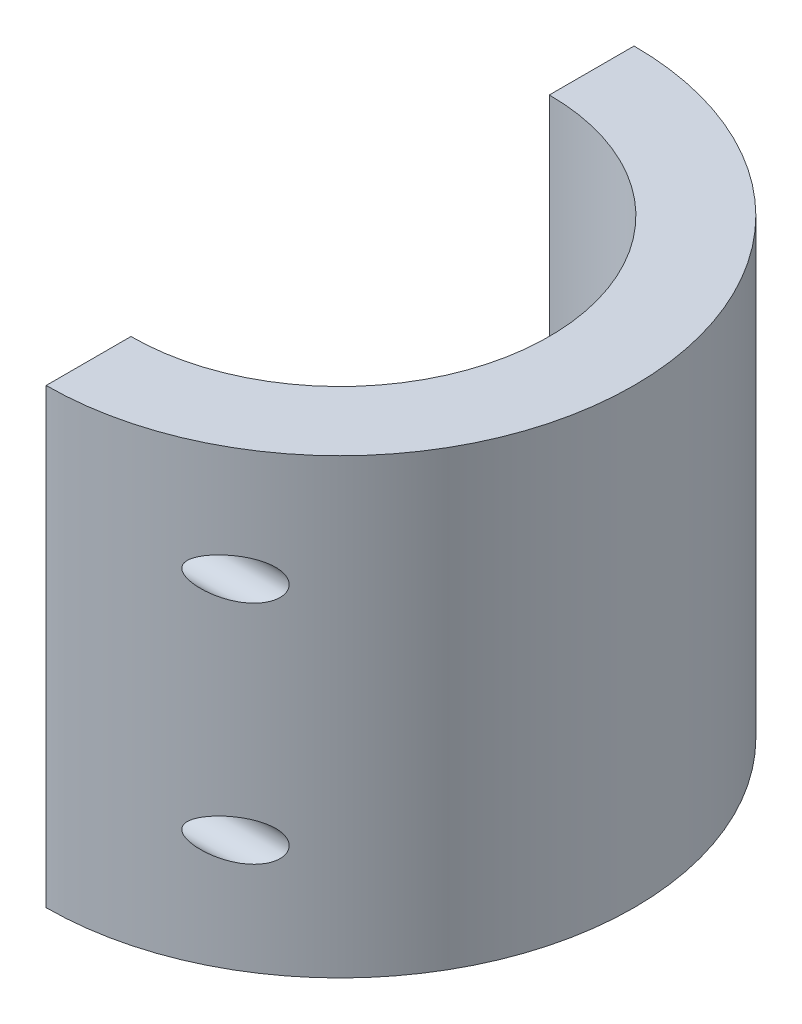
ISO-10303-21;
HEADER;
FILE_DESCRIPTION(('STEP AP214'),'2;1');
FILE_NAME('part.step','',(''),(''),'','','');
FILE_SCHEMA(('AUTOMOTIVE_DESIGN { 1 0 10303 214 1 1 1 1 }'));
ENDSEC;
DATA;
#1=APPLICATION_CONTEXT('core data for automotive mechanical design processes');
#2=APPLICATION_PROTOCOL_DEFINITION('international standard','automotive_design',2000,#1);
#3=PRODUCT_CONTEXT('',#1,'mechanical');
#4=PRODUCT('Part','Part','',(#3));
#5=PRODUCT_RELATED_PRODUCT_CATEGORY('part','',(#4));
#6=PRODUCT_DEFINITION_FORMATION('','',#4);
#7=PRODUCT_DEFINITION_CONTEXT('part definition',#1,'design');
#8=PRODUCT_DEFINITION('design','',#6,#7);
#9=PRODUCT_DEFINITION_SHAPE('','',#8);
#10=(LENGTH_UNIT() NAMED_UNIT(*) SI_UNIT(.MILLI.,.METRE.));
#11=(NAMED_UNIT(*) PLANE_ANGLE_UNIT() SI_UNIT($,.RADIAN.));
#12=(NAMED_UNIT(*) SI_UNIT($,.STERADIAN.) SOLID_ANGLE_UNIT());
#13=UNCERTAINTY_MEASURE_WITH_UNIT(LENGTH_MEASURE(1.E-05),#10,'distance_accuracy_value','');
#14=(GEOMETRIC_REPRESENTATION_CONTEXT(3) GLOBAL_UNCERTAINTY_ASSIGNED_CONTEXT((#13)) GLOBAL_UNIT_ASSIGNED_CONTEXT((#10,
#11,#12)) REPRESENTATION_CONTEXT('',''));
#15=CARTESIAN_POINT('',(0.,0.,0.));
#16=DIRECTION('',(0.,0.,1.));
#17=DIRECTION('',(1.,0.,0.));
#18=AXIS2_PLACEMENT_3D('',#15,#16,#17);
#19=CARTESIAN_POINT('',(0.,20.32,0.));
#20=DIRECTION('',(0.,-1.,0.));
#21=DIRECTION('',(0.,0.,-1.));
#22=AXIS2_PLACEMENT_3D('',#19,#20,#21);
#23=CYLINDRICAL_SURFACE('',#22,13.208);
#24=CARTESIAN_POINT('',(8.12403028059349,15.24,-10.414));
#25=CARTESIAN_POINT('',(8.12402675839397,15.2763425855837,-10.4140029529824));
#26=CARTESIAN_POINT('',(8.12114471221945,15.3127085634343,-10.4162530184276));
#27=CARTESIAN_POINT('',(8.10989942678019,15.3840607142762,-10.4250104305107));
#28=CARTESIAN_POINT('',(8.10152879578814,15.4190449589643,-10.431523518334));
#29=CARTESIAN_POINT('',(8.08014387084861,15.4862733885964,-10.4480963483917));
#30=CARTESIAN_POINT('',(8.06717093354128,15.5185389077562,-10.4581244947683));
#31=CARTESIAN_POINT('',(8.03743681280789,15.580160225113,-10.4809935702237));
#32=CARTESIAN_POINT('',(8.02067400406546,15.6095147671213,-10.4938357060313));
#33=CARTESIAN_POINT('',(7.97511667896051,15.6789556067451,-10.5285299327843));
#34=CARTESIAN_POINT('',(7.9444726520898,15.7171660373587,-10.5516962182333));
#35=CARTESIAN_POINT('',(7.87856697558927,15.7871319441255,-10.6009980079177));
#36=CARTESIAN_POINT('',(7.84329382947684,15.8188708296954,-10.6271408824121));
#37=CARTESIAN_POINT('',(7.74755476468098,15.8937762719516,-10.6972865690547));
#38=CARTESIAN_POINT('',(7.68460751080956,15.93247333955,-10.7426444021067));
#39=CARTESIAN_POINT('',(7.55393517240757,15.9979170309071,-10.834933615685));
#40=CARTESIAN_POINT('',(7.48620057106773,16.0246390290152,-10.8818680273123));
#41=CARTESIAN_POINT('',(7.35868532034689,16.0647818227098,-10.9684086198165));
#42=CARTESIAN_POINT('',(7.29933394982558,16.0796353355708,-11.0080037356914));
#43=CARTESIAN_POINT('',(7.17912920646289,16.103284161471,-11.0867730370386));
#44=CARTESIAN_POINT('',(7.11827483410135,16.1120753241009,-11.1259469160968));
#45=CARTESIAN_POINT('',(6.99544156378007,16.1242988577958,-11.2035865646449));
#46=CARTESIAN_POINT('',(6.93346077114572,16.1277211494366,-11.2420508685844));
#47=CARTESIAN_POINT('',(6.80880870397798,16.1296845521613,-11.3179820585784));
#48=CARTESIAN_POINT('',(6.74613726640222,16.1282244849364,-11.3554487016579));
#49=CARTESIAN_POINT('',(6.60031165406951,16.1195865996291,-11.4409960971043));
#50=CARTESIAN_POINT('',(6.51700294863812,16.1107329174484,-11.4886487755221));
#51=CARTESIAN_POINT('',(6.35017570329106,16.0855621350588,-11.5816951652706));
#52=CARTESIAN_POINT('',(6.26665705123765,16.0692392970186,-11.6270871101177));
#53=CARTESIAN_POINT('',(6.0999893971425,16.0290590212001,-11.7153873010863));
#54=CARTESIAN_POINT('',(6.01684092696757,16.0051929894365,-11.7582926479117));
#55=CARTESIAN_POINT('',(5.85192194850897,15.9493219871575,-11.8412311585377));
#56=CARTESIAN_POINT('',(5.77014973516252,15.9173280217692,-11.8812681128752));
#57=CARTESIAN_POINT('',(5.65131368791182,15.8626929647352,-11.9379961197164));
#58=CARTESIAN_POINT('',(5.61312110632241,15.84384452982,-11.9559972376178));
#59=CARTESIAN_POINT('',(5.53773307468417,15.8035199837386,-11.9911008546527));
#60=CARTESIAN_POINT('',(5.50053711315328,15.7820452531895,-12.0082038192344));
#61=CARTESIAN_POINT('',(5.42781513446303,15.7360917494589,-12.0412488397324));
#62=CARTESIAN_POINT('',(5.39228112896853,15.711629965557,-12.0571967083979));
#63=CARTESIAN_POINT('',(5.32354185916334,15.6589153327588,-12.0877032442451));
#64=CARTESIAN_POINT('',(5.29033199752997,15.6306703097593,-12.102264675736));
#65=CARTESIAN_POINT('',(5.23527942201222,15.5767110700311,-12.1261613021378));
#66=CARTESIAN_POINT('',(5.21262394238774,15.552022293299,-12.1359111058156));
#67=CARTESIAN_POINT('',(5.17079373646744,15.4993153744729,-12.1537923368746));
#68=CARTESIAN_POINT('',(5.15160946761373,15.4713067213528,-12.1619282071798));
#69=CARTESIAN_POINT('',(5.12468359438533,15.4224677641265,-12.1732910305729));
#70=CARTESIAN_POINT('',(5.11531421171454,15.4027118462638,-12.1772286609773));
#71=CARTESIAN_POINT('',(5.0995171385575,15.3618475289058,-12.1838525236996));
#72=CARTESIAN_POINT('',(5.09308623655063,15.3407406348311,-12.1865401222585));
#73=CARTESIAN_POINT('',(5.08380220538361,15.2973664736221,-12.1904161617635));
#74=CARTESIAN_POINT('',(5.08098601406709,15.2750896109016,-12.1915891257497));
#75=CARTESIAN_POINT('',(5.07945156958719,15.2303727077212,-12.1922285452093));
#76=CARTESIAN_POINT('',(5.08073141585397,15.20793274776,-12.1916957921388));
#77=CARTESIAN_POINT('',(5.08678112610931,15.1665525388773,-12.1891726368652));
#78=CARTESIAN_POINT('',(5.09108861015596,15.1475289020143,-12.1873753246701));
#79=CARTESIAN_POINT('',(5.10226304469577,15.1103958393931,-12.1827013687));
#80=CARTESIAN_POINT('',(5.10913161261638,15.0922869995897,-12.1798240428453));
#81=CARTESIAN_POINT('',(5.12958518023046,15.0468507942085,-12.1712284482766));
#82=CARTESIAN_POINT('',(5.14474450319814,15.0203654879068,-12.1648345920944));
#83=CARTESIAN_POINT('',(5.17856469878685,14.9702059339822,-12.1504762870157));
#84=CARTESIAN_POINT('',(5.19723664443767,14.946540973359,-12.1425068672258));
#85=CARTESIAN_POINT('',(5.25404059548756,14.8822585898889,-12.1180823221139));
#86=CARTESIAN_POINT('',(5.29501829276508,14.8447146979247,-12.1002567688962));
#87=CARTESIAN_POINT('',(5.38093909694976,14.7759685617304,-12.0622966972846));
#88=CARTESIAN_POINT('',(5.4258930911849,14.7447845534712,-12.0421557911828));
#89=CARTESIAN_POINT('',(5.52304760291226,14.6841717305416,-11.9979312052203));
#90=CARTESIAN_POINT('',(5.57550541134205,14.6552996001608,-11.9736567951988));
#91=CARTESIAN_POINT('',(5.68203980516664,14.6022961266128,-11.9234713109871));
#92=CARTESIAN_POINT('',(5.7361181011353,14.5781700121371,-11.8975584727956));
#93=CARTESIAN_POINT('',(5.84536378540801,14.5339185173396,-11.8442681910116));
#94=CARTESIAN_POINT('',(5.90053359751777,14.5138034869707,-11.8168871840169));
#95=CARTESIAN_POINT('',(6.01144353139748,14.4772358022923,-11.7608535237564));
#96=CARTESIAN_POINT('',(6.0671837943324,14.4607840786142,-11.7322005495706));
#97=CARTESIAN_POINT('',(6.20670162745626,14.424006935579,-11.6592031402946));
#98=CARTESIAN_POINT('',(6.29066550232646,14.4058108389916,-11.6141281956257));
#99=CARTESIAN_POINT('',(6.45862483472474,14.37692634902,-11.5215726131762));
#100=CARTESIAN_POINT('',(6.54262027405969,14.3662431455044,-11.4740903366506));
#101=CARTESIAN_POINT('',(6.70975512883651,14.3527523906886,-11.3771591323494));
#102=CARTESIAN_POINT('',(6.7928964471224,14.3499191543355,-11.3277171566402));
#103=CARTESIAN_POINT('',(6.95790929967787,14.3528172959755,-11.2271137524416));
#104=CARTESIAN_POINT('',(7.03978200135329,14.3585402611971,-11.1759540612052));
#105=CARTESIAN_POINT('',(7.19667453799487,14.3791595605468,-11.0755266507942));
#106=CARTESIAN_POINT('',(7.27181141371172,14.3934869266661,-11.0263287129227));
#107=CARTESIAN_POINT('',(7.41930584125426,14.4323906437557,-10.9276260516637));
#108=CARTESIAN_POINT('',(7.49166360858563,14.4569661982719,-10.878121352411));
#109=CARTESIAN_POINT('',(7.61931599124117,14.5131092848789,-10.7889868170932));
#110=CARTESIAN_POINT('',(7.67535558463602,14.5426541733931,-10.7491674766562));
#111=CARTESIAN_POINT('',(7.78258904140313,14.6118514768532,-10.6717803118799));
#112=CARTESIAN_POINT('',(7.83379491127137,14.6514778933603,-10.6342069986842));
#113=CARTESIAN_POINT('',(7.90921944154319,14.7242002428284,-10.5781265872595));
#114=CARTESIAN_POINT('',(7.93597384376173,14.7534500650328,-10.5580567391003));
#115=CARTESIAN_POINT('',(7.98570484295272,14.8165083423367,-10.5204916885031));
#116=CARTESIAN_POINT('',(8.00868557344695,14.8503117347327,-10.5029936712248));
#117=CARTESIAN_POINT('',(8.04573252206672,14.9157333803322,-10.4746309960392));
#118=CARTESIAN_POINT('',(8.06066193312728,14.9465846738334,-10.4631378502726));
#119=CARTESIAN_POINT('',(8.0862765704699,15.0109609005529,-10.4433547530368));
#120=CARTESIAN_POINT('',(8.0969686857514,15.0444813867311,-10.4350596028655));
#121=CARTESIAN_POINT('',(8.11132349134013,15.1050389865113,-10.4239031445968));
#122=CARTESIAN_POINT('',(8.11606344107157,15.1316696992383,-10.4202108752562));
#123=CARTESIAN_POINT('',(8.12241817037074,15.1855292230289,-10.4152581848575));
#124=CARTESIAN_POINT('',(8.12403292079142,15.2127580396683,-10.4139977864803));
#125=CARTESIAN_POINT('',(8.12403028059349,15.24,-10.414));
#126=B_SPLINE_CURVE_WITH_KNOTS('',3,(#24,#25,#26,#27,#28,#29,#30,#31,#32,#33,#34,#35,#36,#37,
#38,#39,#40,#41,#42,#43,#44,#45,#46,#47,#48,#49,#50,#51,#52,#53,#54,#55,#56,#57,#58,#59,#60,#61,
#62,#63,#64,#65,#66,#67,#68,#69,#70,#71,#72,#73,#74,#75,#76,#77,#78,#79,#80,#81,#82,#83,#84,#85,
#86,#87,#88,#89,#90,#91,#92,#93,#94,#95,#96,#97,#98,#99,#100,#101,#102,#103,#104,#105,#106,#107,
#108,#109,#110,#111,#112,#113,#114,#115,#116,#117,#118,#119,#120,#121,#122,#123,#124,#125),
.UNSPECIFIED.,.T.,.F.,(4,2,2,2,2,2,2,2,2,2,2,2,2,2,2,2,2,2,2,2,2,2,2,2,2,2,2,2,2,2,2,2,2,2,2,2,
2,2,2,2,2,2,2,2,2,2,2,2,2,2,4),(0.,0.108895737153561,0.217938431210734,0.326025096118373,
0.434158203071781,0.59579057708297,0.757832244882077,1.01648891326617,1.27567507199651,
1.49400486595239,1.7124839849611,1.93137278407168,2.15031441362983,2.439120356858,
2.72814853523972,3.01750719861366,3.30647614264454,3.44512105882961,3.58369340157598,
3.72151140690776,3.85904860624725,3.96350313672445,4.06766600212435,4.13410138319973,
4.20046398110345,4.26749946003276,4.33450383887303,4.39302492076745,4.45158302384875,
4.5445807070555,4.63787661939231,4.81199272936052,4.98660128035837,5.18013722901771,
5.37388521681995,5.5681268485781,5.76241776959144,6.05312830478732,6.34403946461023,
6.63399763412182,6.92367089355621,7.19602360224634,7.46835514855901,7.69222171994366,
7.91551673038549,8.04845386564781,8.18124440155547,8.28928568659526,8.39715059023283,
8.47877674966292,8.56040367037267),.UNSPECIFIED.);
#127=CARTESIAN_POINT('',(8.12403028059349,15.24,-10.414));
#128=VERTEX_POINT('',#127);
#129=EDGE_CURVE('E43',#128,#128,#126,.T.);
#130=ORIENTED_EDGE('',*,*,#129,.T.);
#131=EDGE_LOOP('',(#130));
#132=FACE_BOUND('',#131,.T.);
#133=CARTESIAN_POINT('',(5.08,15.24,12.192));
#134=CARTESIAN_POINT('',(5.08000265332139,15.2615626758488,12.191998947532));
#135=CARTESIAN_POINT('',(5.08190721766739,15.283137429931,12.1912058541229));
#136=CARTESIAN_POINT('',(5.08927926000099,15.32556219886,12.188130102399));
#137=CARTESIAN_POINT('',(5.09475236539998,15.3464110141437,12.1858450913965));
#138=CARTESIAN_POINT('',(5.11048954060207,15.3922011635461,12.1792548843575));
#139=CARTESIAN_POINT('',(5.12163394786787,15.4167807400137,12.1745769095507));
#140=CARTESIAN_POINT('',(5.14733963061768,15.4637100956346,12.163731118152));
#141=CARTESIAN_POINT('',(5.16190864167248,15.4860546609575,12.1575599277107));
#142=CARTESIAN_POINT('',(5.20478672292413,15.5440202962613,12.1392881375161));
#143=CARTESIAN_POINT('',(5.23541555345702,15.5775636140621,12.1261258865621));
#144=CARTESIAN_POINT('',(5.30049656906654,15.639682111218,12.0978211873688));
#145=CARTESIAN_POINT('',(5.33495952298013,15.6682426876614,12.0826731392646));
#146=CARTESIAN_POINT('',(5.40906433375384,15.7236242933088,12.0496913807935));
#147=CARTESIAN_POINT('',(5.44889926386589,15.7501124681169,12.0317393602677));
#148=CARTESIAN_POINT('',(5.53022248038257,15.7994583134168,11.9945783296891));
#149=CARTESIAN_POINT('',(5.5717125282732,15.822311979516,11.9753679656722));
#150=CARTESIAN_POINT('',(5.65583778803919,15.8650177237459,11.9358672576688));
#151=CARTESIAN_POINT('',(5.69847538909956,15.8848628592879,11.9155745575298));
#152=CARTESIAN_POINT('',(5.78446119789411,15.9218879885231,11.8740707391578));
#153=CARTESIAN_POINT('',(5.82780963114013,15.9390671176028,11.8528593258174));
#154=CARTESIAN_POINT('',(5.9529204306029,15.9849423891685,11.7907705918396));
#155=CARTESIAN_POINT('',(6.03527279721911,16.0106456756279,11.7488480243608));
#156=CARTESIAN_POINT('',(6.20066441330851,16.0545505707737,11.6624077431794));
#157=CARTESIAN_POINT('',(6.28370419502289,16.0727456753567,11.6178878174067));
#158=CARTESIAN_POINT('',(6.44973591045947,16.1017687151268,11.5265404342398));
#159=CARTESIAN_POINT('',(6.53272783570768,16.1126019326016,11.4797146572636));
#160=CARTESIAN_POINT('',(6.69808827718878,16.1266179548147,11.3840243407924));
#161=CARTESIAN_POINT('',(6.78045719691597,16.1298062268493,11.3351612837206));
#162=CARTESIAN_POINT('',(6.96540211603526,16.1275903225821,11.2226977674856));
#163=CARTESIAN_POINT('',(7.06766433007552,16.1197368149188,11.1585684845188));
#164=CARTESIAN_POINT('',(7.21831196301267,16.0961391954973,11.0612307922892));
#165=CARTESIAN_POINT('',(7.26803964083004,16.0863137046584,11.0286152560307));
#166=CARTESIAN_POINT('',(7.36629942762439,16.062247252315,10.9632281418294));
#167=CARTESIAN_POINT('',(7.41483204926339,16.048008221076,10.9304566382564));
#168=CARTESIAN_POINT('',(7.52278599709102,16.0101545433959,10.8565314317144));
#169=CARTESIAN_POINT('',(7.58173668583191,15.9850619685852,10.8154263279579));
#170=CARTESIAN_POINT('',(7.69573850777801,15.9253967298764,10.7346040151968));
#171=CARTESIAN_POINT('',(7.75079442725941,15.890835965323,10.6948851342003));
#172=CARTESIAN_POINT('',(7.83814482120595,15.8231520458478,10.6309309699663));
#173=CARTESIAN_POINT('',(7.87211093270442,15.7930650234388,10.605787658919));
#174=CARTESIAN_POINT('',(7.93592005772034,15.7269681553587,10.5581253121081));
#175=CARTESIAN_POINT('',(7.96576945745568,15.6909676777033,10.5356022203139));
#176=CARTESIAN_POINT('',(8.01256551854628,15.6229213903848,10.50003279194));
#177=CARTESIAN_POINT('',(8.03084688459522,15.5922932438514,10.4860469253109));
#178=CARTESIAN_POINT('',(8.06325306743881,15.5277473126463,10.461148656329));
#179=CARTESIAN_POINT('',(8.07738340457891,15.4938339774563,10.4502321729199));
#180=CARTESIAN_POINT('',(8.09864316918808,15.4289010454086,10.433762295634));
#181=CARTESIAN_POINT('',(8.10652816964349,15.3982776305261,10.4276324086019));
#182=CARTESIAN_POINT('',(8.11811737388908,15.3357824905694,10.418612648876));
#183=CARTESIAN_POINT('',(8.12182411177939,15.3039115342751,10.4157208123241));
#184=CARTESIAN_POINT('',(8.1247745534717,15.2397578995004,10.4134195399056));
#185=CARTESIAN_POINT('',(8.12400765374055,15.2074744239449,10.4140183777244));
#186=CARTESIAN_POINT('',(8.11804884387974,15.1435730395876,10.4186640410192));
#187=CARTESIAN_POINT('',(8.11285567214777,15.1119553231775,10.4227118495411));
#188=CARTESIAN_POINT('',(8.09865015783683,15.0511657185877,10.4337532133669));
#189=CARTESIAN_POINT('',(8.08975521808575,15.0219491632248,10.4406561783126));
#190=CARTESIAN_POINT('',(8.06869656278258,14.9654682499407,10.4569391868367));
#191=CARTESIAN_POINT('',(8.0565315968777,14.9382046438251,10.4663201779088));
#192=CARTESIAN_POINT('',(8.02256891621744,14.8725149334906,10.4923928987179));
#193=CARTESIAN_POINT('',(7.99902499303164,14.8355014950094,10.5103711688927));
#194=CARTESIAN_POINT('',(7.94740837470955,14.7666411690873,10.5494559645128));
#195=CARTESIAN_POINT('',(7.91932415900529,14.734807849281,10.570570436402));
#196=CARTESIAN_POINT('',(7.84401311291277,14.6602745486255,10.6266611571314));
#197=CARTESIAN_POINT('',(7.79457831308135,14.6208615974631,10.6630140295938));
#198=CARTESIAN_POINT('',(7.69096705844371,14.5517490661186,10.7379892332738));
#199=CARTESIAN_POINT('',(7.63678204427822,14.5220674964739,10.7766156181936));
#200=CARTESIAN_POINT('',(7.53431464697586,14.4749998834221,10.8484392498244));
#201=CARTESIAN_POINT('',(7.48648540439754,14.4564038893431,10.8815100001044));
#202=CARTESIAN_POINT('',(7.38923280444604,14.4242176886859,10.947783707523));
#203=CARTESIAN_POINT('',(7.33980840456201,14.410630830934,10.9809867381606));
#204=CARTESIAN_POINT('',(7.23969437521593,14.3878603023203,11.0472486592328));
#205=CARTESIAN_POINT('',(7.18900189495267,14.3786877095453,11.0803069828242));
#206=CARTESIAN_POINT('',(7.08676172150619,14.3643325723175,11.1459754136832));
#207=CARTESIAN_POINT('',(7.03521376891457,14.3591512616061,11.1785853793025));
#208=CARTESIAN_POINT('',(6.90302649511457,14.3505703155892,11.2609251239189));
#209=CARTESIAN_POINT('',(6.82194985122154,14.349709721088,11.3102268829818));
#210=CARTESIAN_POINT('',(6.65893698210065,14.3557704387428,11.4069636608299));
#211=CARTESIAN_POINT('',(6.57700018436147,14.3626973086948,11.4543973213609));
#212=CARTESIAN_POINT('',(6.41305542142474,14.38382117655,11.5469833201934));
#213=CARTESIAN_POINT('',(6.33104815031715,14.3979998941558,11.5921410825984));
#214=CARTESIAN_POINT('',(6.16736357049874,14.4335229903109,11.6800474795201));
#215=CARTESIAN_POINT('',(6.08568605689757,14.4548618625858,11.7227979358814));
#216=CARTESIAN_POINT('',(5.94625533404625,14.4980543764139,11.7939642215788));
#217=CARTESIAN_POINT('',(5.88825649286033,14.5180626718615,11.8230202114988));
#218=CARTESIAN_POINT('',(5.77310479118703,14.5624567148627,11.8796739185689));
#219=CARTESIAN_POINT('',(5.71595333750525,14.5868490146193,11.9072693718197));
#220=CARTESIAN_POINT('',(5.59404292788824,14.6450797291898,11.9650814483429));
#221=CARTESIAN_POINT('',(5.52954905284444,14.6798079240336,11.9949998688095));
#222=CARTESIAN_POINT('',(5.43608737723812,14.7385955219775,12.0374995941369));
#223=CARTESIAN_POINT('',(5.4055232256502,14.7592714193416,12.0512510772472));
#224=CARTESIAN_POINT('',(5.34597278988651,14.803316656598,12.0777851539895));
#225=CARTESIAN_POINT('',(5.31698474055448,14.8266828879939,12.0905688380815));
#226=CARTESIAN_POINT('',(5.26770377633095,14.8710423979019,12.1121060398418));
#227=CARTESIAN_POINT('',(5.24693019643293,14.8913713954494,12.1211159110098));
#228=CARTESIAN_POINT('',(5.20741154040699,14.9344049250286,12.1381461315777));
#229=CARTESIAN_POINT('',(5.18867002328848,14.9571134921988,12.1461647482018));
#230=CARTESIAN_POINT('',(5.15399121537088,15.0055938530021,12.1609209379426));
#231=CARTESIAN_POINT('',(5.13810222233393,15.0314079002852,12.1676365794836));
#232=CARTESIAN_POINT('',(5.11118438166107,15.0858552956002,12.1789685244103));
#233=CARTESIAN_POINT('',(5.10013021617098,15.1144729726581,12.1835957679827));
#234=CARTESIAN_POINT('',(5.08838203103187,15.1596901004209,12.188504885183));
#235=CARTESIAN_POINT('',(5.08526089117568,15.1755586382744,12.1898068393737));
#236=CARTESIAN_POINT('',(5.08106894664394,15.207615860256,12.1915547638821));
#237=CARTESIAN_POINT('',(5.07999800712096,15.2238045232578,12.1920007904965));
#238=CARTESIAN_POINT('',(5.08,15.24,12.192));
#239=B_SPLINE_CURVE_WITH_KNOTS('',3,(#133,#134,#135,#136,#137,#138,#139,#140,#141,#142,#143,
#144,#145,#146,#147,#148,#149,#150,#151,#152,#153,#154,#155,#156,#157,#158,#159,#160,#161,#162,
#163,#164,#165,#166,#167,#168,#169,#170,#171,#172,#173,#174,#175,#176,#177,#178,#179,#180,#181,
#182,#183,#184,#185,#186,#187,#188,#189,#190,#191,#192,#193,#194,#195,#196,#197,#198,#199,#200,
#201,#202,#203,#204,#205,#206,#207,#208,#209,#210,#211,#212,#213,#214,#215,#216,#217,#218,#219,
#220,#221,#222,#223,#224,#225,#226,#227,#228,#229,#230,#231,#232,#233,#234,#235,#236,#237,#238),
.UNSPECIFIED.,.T.,.F.,(4,2,2,2,2,2,2,2,2,2,2,2,2,2,2,2,2,2,2,2,2,2,2,2,2,2,2,2,2,2,2,2,2,2,2,2,
2,2,2,2,2,2,2,2,2,2,2,2,2,2,2,2,4),(0.,0.0646175459399832,0.129337237786517,0.211040465967415,
0.292930051403707,0.434010800599707,0.575498312023582,0.728547444055283,0.881764049958487,
1.03532901120205,1.18894367155296,1.47628476516741,1.76387425347483,2.05125717260455,
2.3384345079483,2.70027143956326,2.88096148763058,3.06157262199752,3.28940439275697,
3.51695113442761,3.67215607369366,3.82711746960812,3.94166065793117,4.05605082140716,
4.15226856616405,4.24842792377906,4.34481529328807,4.44123014488804,4.53479566565843,
4.62839701388988,4.7698152091509,4.91159804048266,5.12916863619988,5.34713966108976,
5.53003747841592,5.71305735013549,5.89653416578173,6.08006767304192,6.36434261924857,
6.64882057706139,6.93258493774245,7.21613157727491,7.41964514876276,7.62346545397278,
7.86026001124177,7.97830517857842,8.09621529626722,8.18737553345578,8.27869293636963,
8.37143464545185,8.4636847166274,8.51222140143741,8.56075489374378),.UNSPECIFIED.);
#240=CARTESIAN_POINT('',(5.08,15.24,12.192));
#241=VERTEX_POINT('',#240);
#242=EDGE_CURVE('E193',#241,#241,#239,.T.);
#243=ORIENTED_EDGE('',*,*,#242,.T.);
#244=EDGE_LOOP('',(#243));
#245=FACE_BOUND('',#244,.T.);
#246=CARTESIAN_POINT('',(5.07999999999999,5.08,12.192));
#247=CARTESIAN_POINT('',(5.08000265332138,5.10156267584877,12.191998947532));
#248=CARTESIAN_POINT('',(5.08190721766738,5.12313742993104,12.1912058541229));
#249=CARTESIAN_POINT('',(5.08927926000098,5.16556219886003,12.188130102399));
#250=CARTESIAN_POINT('',(5.09475236539997,5.18641101414372,12.1858450913965));
#251=CARTESIAN_POINT('',(5.11048954060206,5.23220116354605,12.1792548843575));
#252=CARTESIAN_POINT('',(5.12163394786787,5.25678074001369,12.1745769095507));
#253=CARTESIAN_POINT('',(5.14733963061767,5.30371009563462,12.163731118152));
#254=CARTESIAN_POINT('',(5.16190864167248,5.32605466095749,12.1575599277107));
#255=CARTESIAN_POINT('',(5.20478672292413,5.38402029626132,12.1392881375161));
#256=CARTESIAN_POINT('',(5.23541555345701,5.41756361406212,12.1261258865621));
#257=CARTESIAN_POINT('',(5.30049656906654,5.47968211121798,12.0978211873688));
#258=CARTESIAN_POINT('',(5.33495952298013,5.50824268766139,12.0826731392646));
#259=CARTESIAN_POINT('',(5.40906433375384,5.56362429330875,12.0496913807936));
#260=CARTESIAN_POINT('',(5.44889926386589,5.59011246811693,12.0317393602677));
#261=CARTESIAN_POINT('',(5.53022248038257,5.63945831341676,11.9945783296891));
#262=CARTESIAN_POINT('',(5.5717125282732,5.66231197951599,11.9753679656722));
#263=CARTESIAN_POINT('',(5.65583778803919,5.70501772374592,11.9358672576688));
#264=CARTESIAN_POINT('',(5.69847538909955,5.72486285928788,11.9155745575298));
#265=CARTESIAN_POINT('',(5.7844611978941,5.76188798852315,11.8740707391578));
#266=CARTESIAN_POINT('',(5.82780963114013,5.77906711760275,11.8528593258174));
#267=CARTESIAN_POINT('',(5.9529204306029,5.82494238916849,11.7907705918396));
#268=CARTESIAN_POINT('',(6.03527279721911,5.85064567562794,11.7488480243608));
#269=CARTESIAN_POINT('',(6.2006644133085,5.89455057077366,11.6624077431794));
#270=CARTESIAN_POINT('',(6.28370419502288,5.91274567535669,11.6178878174067));
#271=CARTESIAN_POINT('',(6.44973591045947,5.94176871512676,11.5265404342399));
#272=CARTESIAN_POINT('',(6.53272783570768,5.95260193260159,11.4797146572636));
#273=CARTESIAN_POINT('',(6.69808827718878,5.96661795481465,11.3840243407924));
#274=CARTESIAN_POINT('',(6.78045719691597,5.96980622684929,11.3351612837206));
#275=CARTESIAN_POINT('',(6.96540211603526,5.96759032258213,11.2226977674856));
#276=CARTESIAN_POINT('',(7.06766433007551,5.9597368149188,11.1585684845188));
#277=CARTESIAN_POINT('',(7.21831196301267,5.93613919549727,11.0612307922892));
#278=CARTESIAN_POINT('',(7.26803964083004,5.92631370465835,11.0286152560307));
#279=CARTESIAN_POINT('',(7.36629942762438,5.90224725231499,10.9632281418294));
#280=CARTESIAN_POINT('',(7.41483204926339,5.888008221076,10.9304566382564));
#281=CARTESIAN_POINT('',(7.52278599709101,5.85015454339591,10.8565314317144));
#282=CARTESIAN_POINT('',(7.58173668583191,5.82506196858524,10.8154263279579));
#283=CARTESIAN_POINT('',(7.69573850777801,5.76539672987637,10.7346040151968));
#284=CARTESIAN_POINT('',(7.75079442725941,5.73083596532304,10.6948851342003));
#285=CARTESIAN_POINT('',(7.83814482120594,5.66315204584779,10.6309309699663));
#286=CARTESIAN_POINT('',(7.87211093270441,5.63306502343885,10.605787658919));
#287=CARTESIAN_POINT('',(7.93592005772033,5.56696815535866,10.5581253121081));
#288=CARTESIAN_POINT('',(7.96576945745568,5.53096767770327,10.5356022203139));
#289=CARTESIAN_POINT('',(8.01256551854627,5.46292139038485,10.50003279194));
#290=CARTESIAN_POINT('',(8.03084688459521,5.43229324385144,10.4860469253109));
#291=CARTESIAN_POINT('',(8.0632530674388,5.36774731264629,10.461148656329));
#292=CARTESIAN_POINT('',(8.0773834045789,5.33383397745633,10.4502321729199));
#293=CARTESIAN_POINT('',(8.09864316918808,5.26890104540858,10.433762295634));
#294=CARTESIAN_POINT('',(8.10652816964348,5.23827763052612,10.4276324086019));
#295=CARTESIAN_POINT('',(8.11811737388908,5.17578249056939,10.418612648876));
#296=CARTESIAN_POINT('',(8.12182411177938,5.14391153427506,10.4157208123241));
#297=CARTESIAN_POINT('',(8.12477455347169,5.07975789950038,10.4134195399056));
#298=CARTESIAN_POINT('',(8.12400765374054,5.04747442394488,10.4140183777244));
#299=CARTESIAN_POINT('',(8.11804884387974,4.98357303958757,10.4186640410192));
#300=CARTESIAN_POINT('',(8.11285567214776,4.95195532317746,10.4227118495411));
#301=CARTESIAN_POINT('',(8.09865015783683,4.89116571858768,10.4337532133669));
#302=CARTESIAN_POINT('',(8.08975521808575,4.86194916322485,10.4406561783126));
#303=CARTESIAN_POINT('',(8.06869656278258,4.80546824994068,10.4569391868367));
#304=CARTESIAN_POINT('',(8.0565315968777,4.77820464382507,10.4663201779088));
#305=CARTESIAN_POINT('',(8.02256891621744,4.71251493349062,10.4923928987179));
#306=CARTESIAN_POINT('',(7.99902499303163,4.67550149500935,10.5103711688927));
#307=CARTESIAN_POINT('',(7.94740837470954,4.60664116908726,10.5494559645128));
#308=CARTESIAN_POINT('',(7.91932415900528,4.57480784928105,10.570570436402));
#309=CARTESIAN_POINT('',(7.84401311291277,4.50027454862545,10.6266611571314));
#310=CARTESIAN_POINT('',(7.79457831308134,4.46086159746314,10.6630140295938));
#311=CARTESIAN_POINT('',(7.6909670584437,4.39174906611864,10.7379892332738));
#312=CARTESIAN_POINT('',(7.63678204427822,4.36206749647389,10.7766156181936));
#313=CARTESIAN_POINT('',(7.53431464697585,4.31499988342208,10.8484392498244));
#314=CARTESIAN_POINT('',(7.48648540439754,4.29640388934312,10.8815100001044));
#315=CARTESIAN_POINT('',(7.38923280444603,4.26421768868594,10.947783707523));
#316=CARTESIAN_POINT('',(7.339808404562,4.25063083093404,10.9809867381606));
#317=CARTESIAN_POINT('',(7.23969437521592,4.22786030232027,11.0472486592328));
#318=CARTESIAN_POINT('',(7.18900189495266,4.21868770954528,11.0803069828242));
#319=CARTESIAN_POINT('',(7.08676172150619,4.20433257231745,11.1459754136832));
#320=CARTESIAN_POINT('',(7.03521376891457,4.19915126160607,11.1785853793025));
#321=CARTESIAN_POINT('',(6.90302649511457,4.19057031558924,11.2609251239189));
#322=CARTESIAN_POINT('',(6.82194985122154,4.189709721088,11.3102268829818));
#323=CARTESIAN_POINT('',(6.65893698210065,4.19577043874282,11.4069636608299));
#324=CARTESIAN_POINT('',(6.57700018436146,4.20269730869482,11.4543973213609));
#325=CARTESIAN_POINT('',(6.41305542142473,4.22382117655002,11.5469833201934));
#326=CARTESIAN_POINT('',(6.33104815031715,4.23799989415579,11.5921410825984));
#327=CARTESIAN_POINT('',(6.16736357049873,4.27352299031092,11.6800474795201));
#328=CARTESIAN_POINT('',(6.08568605689757,4.29486186258577,11.7227979358814));
#329=CARTESIAN_POINT('',(5.94625533404624,4.33805437641391,11.7939642215788));
#330=CARTESIAN_POINT('',(5.88825649286032,4.35806267186146,11.8230202114988));
#331=CARTESIAN_POINT('',(5.77310479118702,4.40245671486268,11.8796739185689));
#332=CARTESIAN_POINT('',(5.71595333750524,4.42684901461928,11.9072693718197));
#333=CARTESIAN_POINT('',(5.59404292788823,4.48507972918983,11.9650814483429));
#334=CARTESIAN_POINT('',(5.52954905284443,4.51980792403356,11.9949998688095));
#335=CARTESIAN_POINT('',(5.43608737723811,4.57859552197751,12.0374995941369));
#336=CARTESIAN_POINT('',(5.40552322565019,4.59927141934162,12.0512510772472));
#337=CARTESIAN_POINT('',(5.3459727898865,4.64331665659797,12.0777851539895));
#338=CARTESIAN_POINT('',(5.31698474055447,4.66668288799391,12.0905688380816));
#339=CARTESIAN_POINT('',(5.26770377633094,4.71104239790186,12.1121060398418));
#340=CARTESIAN_POINT('',(5.24693019643292,4.73137139544937,12.1211159110098));
#341=CARTESIAN_POINT('',(5.20741154040699,4.77440492502856,12.1381461315777));
#342=CARTESIAN_POINT('',(5.18867002328847,4.79711349219881,12.1461647482018));
#343=CARTESIAN_POINT('',(5.15399121537087,4.84559385300215,12.1609209379426));
#344=CARTESIAN_POINT('',(5.13810222233393,4.87140790028521,12.1676365794836));
#345=CARTESIAN_POINT('',(5.11118438166106,4.92585529560017,12.1789685244103));
#346=CARTESIAN_POINT('',(5.10013021617097,4.95447297265809,12.1835957679827));
#347=CARTESIAN_POINT('',(5.08838203103186,4.99969010042092,12.188504885183));
#348=CARTESIAN_POINT('',(5.08526089117567,5.01555863827441,12.1898068393737));
#349=CARTESIAN_POINT('',(5.08106894664393,5.04761586025599,12.1915547638821));
#350=CARTESIAN_POINT('',(5.07999800712096,5.06380452325777,12.1920007904965));
#351=CARTESIAN_POINT('',(5.07999999999999,5.08,12.192));
#352=B_SPLINE_CURVE_WITH_KNOTS('',3,(#246,#247,#248,#249,#250,#251,#252,#253,#254,#255,#256,
#257,#258,#259,#260,#261,#262,#263,#264,#265,#266,#267,#268,#269,#270,#271,#272,#273,#274,#275,
#276,#277,#278,#279,#280,#281,#282,#283,#284,#285,#286,#287,#288,#289,#290,#291,#292,#293,#294,
#295,#296,#297,#298,#299,#300,#301,#302,#303,#304,#305,#306,#307,#308,#309,#310,#311,#312,#313,
#314,#315,#316,#317,#318,#319,#320,#321,#322,#323,#324,#325,#326,#327,#328,#329,#330,#331,#332,
#333,#334,#335,#336,#337,#338,#339,#340,#341,#342,#343,#344,#345,#346,#347,#348,#349,#350,#351),
.UNSPECIFIED.,.T.,.F.,(4,2,2,2,2,2,2,2,2,2,2,2,2,2,2,2,2,2,2,2,2,2,2,2,2,2,2,2,2,2,2,2,2,2,2,2,
2,2,2,2,2,2,2,2,2,2,2,2,2,2,2,2,4),(0.,0.064617545939983,0.129337237786516,0.211040465967417,
0.292930051403711,0.434010800599715,0.575498312023591,0.728547444055291,0.881764049958494,
1.03532901120206,1.18894367155297,1.47628476516741,1.76387425347484,2.05125717260456,
2.33843450794831,2.70027143956326,2.88096148763058,3.06157262199753,3.28940439275697,
3.51695113442761,3.67215607369366,3.82711746960812,3.94166065793118,4.05605082140716,
4.15226856616405,4.24842792377907,4.34481529328807,4.44123014488805,4.53479566565844,
4.62839701388989,4.7698152091509,4.91159804048266,5.12916863619988,5.34713966108976,
5.53003747841592,5.71305735013549,5.89653416578173,6.08006767304192,6.36434261924857,
6.64882057706139,6.93258493774245,7.21613157727491,7.41964514876277,7.62346545397278,
7.86026001124178,7.97830517857842,8.09621529626722,8.18737553345579,8.27869293636963,
8.37143464545185,8.4636847166274,8.51222140143741,8.56075489374378),.UNSPECIFIED.);
#353=CARTESIAN_POINT('',(5.07999999999999,5.08,12.192));
#354=VERTEX_POINT('',#353);
#355=EDGE_CURVE('E139',#354,#354,#352,.T.);
#356=ORIENTED_EDGE('',*,*,#355,.T.);
#357=EDGE_LOOP('',(#356));
#358=FACE_BOUND('',#357,.T.);
#359=CARTESIAN_POINT('',(8.12403028059349,5.08,-10.414));
#360=CARTESIAN_POINT('',(8.12402675839397,5.11634258558367,-10.4140029529824));
#361=CARTESIAN_POINT('',(8.12114471221946,5.15270856343432,-10.4162530184276));
#362=CARTESIAN_POINT('',(8.10989942678019,5.22406071427622,-10.4250104305107));
#363=CARTESIAN_POINT('',(8.10152879578814,5.25904495896432,-10.431523518334));
#364=CARTESIAN_POINT('',(8.08014387084861,5.32627338859639,-10.4480963483917));
#365=CARTESIAN_POINT('',(8.06717093354128,5.35853890775622,-10.4581244947683));
#366=CARTESIAN_POINT('',(8.03743681280789,5.42016022511305,-10.4809935702237));
#367=CARTESIAN_POINT('',(8.02067400406546,5.44951476712132,-10.4938357060312));
#368=CARTESIAN_POINT('',(7.97511667896051,5.51895560674512,-10.5285299327843));
#369=CARTESIAN_POINT('',(7.94447265208981,5.55716603735866,-10.5516962182333));
#370=CARTESIAN_POINT('',(7.87856697558927,5.62713194412551,-10.6009980079177));
#371=CARTESIAN_POINT('',(7.84329382947685,5.65887082969544,-10.6271408824121));
#372=CARTESIAN_POINT('',(7.74755476468098,5.73377627195159,-10.6972865690547));
#373=CARTESIAN_POINT('',(7.68460751080957,5.77247333955004,-10.7426444021067));
#374=CARTESIAN_POINT('',(7.55393517240758,5.83791703090706,-10.834933615685));
#375=CARTESIAN_POINT('',(7.48620057106774,5.86463902901516,-10.8818680273123));
#376=CARTESIAN_POINT('',(7.3586853203469,5.90478182270976,-10.9684086198165));
#377=CARTESIAN_POINT('',(7.29933394982559,5.91963533557079,-11.0080037356914));
#378=CARTESIAN_POINT('',(7.17912920646291,5.94328416147096,-11.0867730370385));
#379=CARTESIAN_POINT('',(7.11827483410136,5.95207532410087,-11.1259469160968));
#380=CARTESIAN_POINT('',(6.99544156378009,5.96429885779583,-11.2035865646449));
#381=CARTESIAN_POINT('',(6.93346077114574,5.96772114943664,-11.2420508685844));
#382=CARTESIAN_POINT('',(6.808808703978,5.96968455216131,-11.3179820585784));
#383=CARTESIAN_POINT('',(6.74613726640224,5.96822448493641,-11.3554487016579));
#384=CARTESIAN_POINT('',(6.60031165406953,5.95958659962906,-11.4409960971043));
#385=CARTESIAN_POINT('',(6.51700294863814,5.9507329174484,-11.4886487755221));
#386=CARTESIAN_POINT('',(6.35017570329108,5.92556213505883,-11.5816951652706));
#387=CARTESIAN_POINT('',(6.26665705123767,5.90923929701859,-11.6270871101177));
#388=CARTESIAN_POINT('',(6.09998939714253,5.86905902120009,-11.7153873010863));
#389=CARTESIAN_POINT('',(6.01684092696759,5.8451929894365,-11.7582926479117));
#390=CARTESIAN_POINT('',(5.85192194850899,5.78932198715747,-11.8412311585376));
#391=CARTESIAN_POINT('',(5.77014973516253,5.75732802176917,-11.8812681128752));
#392=CARTESIAN_POINT('',(5.65131368791184,5.70269296473522,-11.9379961197164));
#393=CARTESIAN_POINT('',(5.61312110632243,5.68384452981998,-11.9559972376178));
#394=CARTESIAN_POINT('',(5.53773307468419,5.64351998373864,-11.9911008546527));
#395=CARTESIAN_POINT('',(5.5005371131533,5.6220452531895,-12.0082038192344));
#396=CARTESIAN_POINT('',(5.42781513446304,5.57609174945891,-12.0412488397324));
#397=CARTESIAN_POINT('',(5.39228112896854,5.55162996555697,-12.0571967083979));
#398=CARTESIAN_POINT('',(5.32354185916336,5.4989153327588,-12.0877032442451));
#399=CARTESIAN_POINT('',(5.29033199752998,5.47067030975929,-12.102264675736));
#400=CARTESIAN_POINT('',(5.23527942201224,5.41671107003107,-12.1261613021378));
#401=CARTESIAN_POINT('',(5.21262394238776,5.39202229329902,-12.1359111058156));
#402=CARTESIAN_POINT('',(5.17079373646746,5.33931537447291,-12.1537923368746));
#403=CARTESIAN_POINT('',(5.15160946761374,5.31130672135283,-12.1619282071798));
#404=CARTESIAN_POINT('',(5.12468359438535,5.26246776412649,-12.1732910305729));
#405=CARTESIAN_POINT('',(5.11531421171455,5.24271184626383,-12.1772286609773));
#406=CARTESIAN_POINT('',(5.09951713855751,5.20184752890585,-12.1838525236996));
#407=CARTESIAN_POINT('',(5.09308623655064,5.18074063483112,-12.1865401222585));
#408=CARTESIAN_POINT('',(5.08380220538361,5.13736647362212,-12.1904161617635));
#409=CARTESIAN_POINT('',(5.0809860140671,5.11508961090158,-12.1915891257497));
#410=CARTESIAN_POINT('',(5.0794515695872,5.07037270772123,-12.1922285452093));
#411=CARTESIAN_POINT('',(5.08073141585398,5.04793274776,-12.1916957921388));
#412=CARTESIAN_POINT('',(5.08678112610932,5.0065525388773,-12.1891726368652));
#413=CARTESIAN_POINT('',(5.09108861015596,4.98752890201433,-12.1873753246701));
#414=CARTESIAN_POINT('',(5.10226304469577,4.95039583939306,-12.1827013687));
#415=CARTESIAN_POINT('',(5.10913161261638,4.93228699958968,-12.1798240428453));
#416=CARTESIAN_POINT('',(5.12958518023046,4.8868507942085,-12.1712284482766));
#417=CARTESIAN_POINT('',(5.14474450319814,4.86036548790682,-12.1648345920944));
#418=CARTESIAN_POINT('',(5.17856469878685,4.81020593398222,-12.1504762870157));
#419=CARTESIAN_POINT('',(5.19723664443767,4.78654097335899,-12.1425068672258));
#420=CARTESIAN_POINT('',(5.25404059548755,4.72225858988888,-12.1180823221139));
#421=CARTESIAN_POINT('',(5.29501829276507,4.68471469792474,-12.1002567688962));
#422=CARTESIAN_POINT('',(5.38093909694975,4.61596856173036,-12.0622966972846));
#423=CARTESIAN_POINT('',(5.42589309118489,4.58478455347126,-12.0421557911828));
#424=CARTESIAN_POINT('',(5.52304760291224,4.52417173054159,-11.9979312052203));
#425=CARTESIAN_POINT('',(5.57550541134203,4.49529960016078,-11.9736567951988));
#426=CARTESIAN_POINT('',(5.68203980516661,4.44229612661278,-11.9234713109871));
#427=CARTESIAN_POINT('',(5.73611810113528,4.41817001213714,-11.8975584727956));
#428=CARTESIAN_POINT('',(5.84536378540799,4.37391851733959,-11.8442681910117));
#429=CARTESIAN_POINT('',(5.90053359751774,4.35380348697076,-11.8168871840169));
#430=CARTESIAN_POINT('',(6.01144353139744,4.31723580229236,-11.7608535237564));
#431=CARTESIAN_POINT('',(6.06718379433237,4.30078407861424,-11.7322005495706));
#432=CARTESIAN_POINT('',(6.20670162745622,4.26400693557897,-11.6592031402946));
#433=CARTESIAN_POINT('',(6.29066550232642,4.24581083899161,-11.6141281956257));
#434=CARTESIAN_POINT('',(6.4586248347247,4.21692634901999,-11.5215726131762));
#435=CARTESIAN_POINT('',(6.54262027405966,4.20624314550437,-11.4740903366506));
#436=CARTESIAN_POINT('',(6.70975512883648,4.19275239068863,-11.3771591323495));
#437=CARTESIAN_POINT('',(6.79289644712236,4.18991915433554,-11.3277171566403));
#438=CARTESIAN_POINT('',(6.95790929967783,4.19281729597545,-11.2271137524416));
#439=CARTESIAN_POINT('',(7.03978200135326,4.19854026119713,-11.1759540612052));
#440=CARTESIAN_POINT('',(7.19667453799484,4.21915956054677,-11.0755266507942));
#441=CARTESIAN_POINT('',(7.27181141371169,4.23348692666608,-11.0263287129228));
#442=CARTESIAN_POINT('',(7.41930584125425,4.2723906437557,-10.9276260516637));
#443=CARTESIAN_POINT('',(7.49166360858561,4.29696619827185,-10.878121352411));
#444=CARTESIAN_POINT('',(7.61931599124116,4.35310928487887,-10.7889868170932));
#445=CARTESIAN_POINT('',(7.67535558463601,4.3826541733931,-10.7491674766562));
#446=CARTESIAN_POINT('',(7.78258904140312,4.45185147685316,-10.6717803118799));
#447=CARTESIAN_POINT('',(7.83379491127136,4.49147789336033,-10.6342069986842));
#448=CARTESIAN_POINT('',(7.90921944154318,4.5642002428284,-10.5781265872595));
#449=CARTESIAN_POINT('',(7.93597384376172,4.59345006503274,-10.5580567391003));
#450=CARTESIAN_POINT('',(7.98570484295272,4.65650834233674,-10.5204916885031));
#451=CARTESIAN_POINT('',(8.00868557344695,4.69031173473264,-10.5029936712248));
#452=CARTESIAN_POINT('',(8.04573252206672,4.7557333803322,-10.4746309960392));
#453=CARTESIAN_POINT('',(8.06066193312727,4.78658467383341,-10.4631378502726));
#454=CARTESIAN_POINT('',(8.0862765704699,4.8509609005529,-10.4433547530368));
#455=CARTESIAN_POINT('',(8.0969686857514,4.88448138673108,-10.4350596028655));
#456=CARTESIAN_POINT('',(8.11132349134014,4.9450389865113,-10.4239031445968));
#457=CARTESIAN_POINT('',(8.11606344107158,4.97166969923825,-10.4202108752562));
#458=CARTESIAN_POINT('',(8.12241817037075,5.02552922302886,-10.4152581848575));
#459=CARTESIAN_POINT('',(8.12403292079143,5.05275803966832,-10.4139977864803));
#460=CARTESIAN_POINT('',(8.12403028059349,5.08,-10.414));
#461=B_SPLINE_CURVE_WITH_KNOTS('',3,(#359,#360,#361,#362,#363,#364,#365,#366,#367,#368,#369,
#370,#371,#372,#373,#374,#375,#376,#377,#378,#379,#380,#381,#382,#383,#384,#385,#386,#387,#388,
#389,#390,#391,#392,#393,#394,#395,#396,#397,#398,#399,#400,#401,#402,#403,#404,#405,#406,#407,
#408,#409,#410,#411,#412,#413,#414,#415,#416,#417,#418,#419,#420,#421,#422,#423,#424,#425,#426,
#427,#428,#429,#430,#431,#432,#433,#434,#435,#436,#437,#438,#439,#440,#441,#442,#443,#444,#445,
#446,#447,#448,#449,#450,#451,#452,#453,#454,#455,#456,#457,#458,#459,#460),.UNSPECIFIED.,.T.,
.F.,(4,2,2,2,2,2,2,2,2,2,2,2,2,2,2,2,2,2,2,2,2,2,2,2,2,2,2,2,2,2,2,2,2,2,2,2,2,2,2,2,2,2,2,2,2,
2,2,2,2,2,4),(0.,0.108895737153562,0.217938431210734,0.326025096118372,0.434158203071779,
0.595790577082965,0.757832244882072,1.01648891326616,1.2756750719965,1.49400486595238,
1.71248398496108,1.93137278407166,2.15031441362982,2.43912035685798,2.7281485352397,
3.01750719861365,3.30647614264453,3.44512105882959,3.58369340157596,3.72151140690774,
3.85904860624723,3.96350313672444,4.06766600212434,4.13410138319972,4.20046398110344,
4.26749946003275,4.33450383887302,4.39302492076744,4.45158302384874,4.54458070705549,
4.63787661939229,4.8119927293605,4.98660128035834,5.18013722901767,5.37388521681991,
5.56812684857805,5.76241776959138,6.05312830478726,6.34403946461019,6.63399763412177,
6.92367089355617,7.19602360224631,7.46835514855899,7.69222171994364,7.91551673038547,
8.04845386564779,8.18124440155546,8.28928568659525,8.39715059023281,8.47877674966291,
8.56040367037267),.UNSPECIFIED.);
#462=CARTESIAN_POINT('',(8.12403028059349,5.08,-10.414));
#463=VERTEX_POINT('',#462);
#464=EDGE_CURVE('E119',#463,#463,#461,.T.);
#465=ORIENTED_EDGE('',*,*,#464,.T.);
#466=EDGE_LOOP('',(#465));
#467=FACE_BOUND('',#466,.T.);
#468=CARTESIAN_POINT('',(0.,0.,0.));
#469=DIRECTION('',(0.,1.,0.));
#470=DIRECTION('',(0.,0.,1.));
#471=AXIS2_PLACEMENT_3D('',#468,#469,#470);
#472=CIRCLE('',#471,13.208);
#473=CARTESIAN_POINT('',(0.,0.,13.208));
#474=VERTEX_POINT('',#473);
#475=CARTESIAN_POINT('',(0.,0.,-13.208));
#476=VERTEX_POINT('',#475);
#477=EDGE_CURVE('E115',#474,#476,#472,.T.);
#478=ORIENTED_EDGE('',*,*,#477,.T.);
#479=DIRECTION('',(0.,-1.,0.));
#480=VECTOR('',#479,1.);
#481=CARTESIAN_POINT('',(0.,20.32,-13.208));
#482=LINE('',#481,#480);
#483=CARTESIAN_POINT('',(0.,20.32,-13.208));
#484=VERTEX_POINT('',#483);
#485=EDGE_CURVE('E11',#484,#476,#482,.T.);
#486=ORIENTED_EDGE('',*,*,#485,.F.);
#487=CARTESIAN_POINT('',(0.,20.32,0.));
#488=DIRECTION('',(0.,1.,0.));
#489=DIRECTION('',(0.,0.,1.));
#490=AXIS2_PLACEMENT_3D('',#487,#488,#489);
#491=CIRCLE('',#490,13.208);
#492=CARTESIAN_POINT('',(0.,20.32,13.208));
#493=VERTEX_POINT('',#492);
#494=EDGE_CURVE('E94',#493,#484,#491,.T.);
#495=ORIENTED_EDGE('',*,*,#494,.F.);
#496=DIRECTION('',(0.,-1.,0.));
#497=VECTOR('',#496,1.);
#498=CARTESIAN_POINT('',(0.,20.32,13.208));
#499=LINE('',#498,#497);
#500=EDGE_CURVE('E111',#493,#474,#499,.T.);
#501=ORIENTED_EDGE('',*,*,#500,.T.);
#502=EDGE_LOOP('',(#478,#486,#495,#501));
#503=FACE_BOUND('',#502,.T.);
#504=ADVANCED_FACE('F39',(#132,#245,#358,#467,#503),#23,.T.);
#505=CARTESIAN_POINT('',(0.,20.32,-13.208));
#506=DIRECTION('',(1.,0.,0.));
#507=DIRECTION('',(0.,0.,-1.));
#508=AXIS2_PLACEMENT_3D('',#505,#506,#507);
#509=PLANE('',#508);
#510=CARTESIAN_POINT('',(0.,15.24,-11.303));
#511=DIRECTION('',(-1.,0.,0.));
#512=DIRECTION('',(0.,0.,1.));
#513=AXIS2_PLACEMENT_3D('',#510,#511,#512);
#514=CIRCLE('',#513,0.888999999999997);
#515=CARTESIAN_POINT('',(0.,15.24,-10.414));
#516=VERTEX_POINT('',#515);
#517=EDGE_CURVE('E172',#516,#516,#514,.T.);
#518=ORIENTED_EDGE('',*,*,#517,.F.);
#519=EDGE_LOOP('',(#518));
#520=FACE_BOUND('',#519,.T.);
#521=CARTESIAN_POINT('',(0.,5.08,-11.303));
#522=DIRECTION('',(-1.,0.,0.));
#523=DIRECTION('',(0.,0.,1.));
#524=AXIS2_PLACEMENT_3D('',#521,#522,#523);
#525=CIRCLE('',#524,0.888999999999998);
#526=CARTESIAN_POINT('',(0.,5.08,-10.414));
#527=VERTEX_POINT('',#526);
#528=EDGE_CURVE('E138',#527,#527,#525,.T.);
#529=ORIENTED_EDGE('',*,*,#528,.F.);
#530=EDGE_LOOP('',(#529));
#531=FACE_BOUND('',#530,.T.);
#532=DIRECTION('',(0.,0.,1.));
#533=VECTOR('',#532,1.);
#534=CARTESIAN_POINT('',(0.,0.,-13.208));
#535=LINE('',#534,#533);
#536=CARTESIAN_POINT('',(0.,0.,-9.398));
#537=VERTEX_POINT('',#536);
#538=EDGE_CURVE('E100',#476,#537,#535,.T.);
#539=ORIENTED_EDGE('',*,*,#538,.T.);
#540=DIRECTION('',(0.,-1.,0.));
#541=VECTOR('',#540,1.);
#542=CARTESIAN_POINT('',(0.,20.32,-9.398));
#543=LINE('',#542,#541);
#544=CARTESIAN_POINT('',(0.,20.32,-9.398));
#545=VERTEX_POINT('',#544);
#546=EDGE_CURVE('E54',#545,#537,#543,.T.);
#547=ORIENTED_EDGE('',*,*,#546,.F.);
#548=DIRECTION('',(0.,0.,1.));
#549=VECTOR('',#548,1.);
#550=CARTESIAN_POINT('',(0.,20.32,-13.208));
#551=LINE('',#550,#549);
#552=EDGE_CURVE('E89',#484,#545,#551,.T.);
#553=ORIENTED_EDGE('',*,*,#552,.F.);
#554=ORIENTED_EDGE('',*,*,#485,.T.);
#555=EDGE_LOOP('',(#539,#547,#553,#554));
#556=FACE_BOUND('',#555,.T.);
#557=ADVANCED_FACE('F99',(#520,#531,#556),#509,.F.);
#558=CARTESIAN_POINT('',(0.,20.32,0.));
#559=DIRECTION('',(0.,-1.,0.));
#560=DIRECTION('',(0.,0.,-1.));
#561=AXIS2_PLACEMENT_3D('',#558,#559,#560);
#562=CYLINDRICAL_SURFACE('',#561,9.398);
#563=CARTESIAN_POINT('',(0.,0.,0.));
#564=DIRECTION('',(0.,1.,0.));
#565=DIRECTION('',(0.,0.,1.));
#566=AXIS2_PLACEMENT_3D('',#563,#564,#565);
#567=CIRCLE('',#566,9.398);
#568=CARTESIAN_POINT('',(0.,0.,9.398));
#569=VERTEX_POINT('',#568);
#570=EDGE_CURVE('E122',#569,#537,#567,.T.);
#571=ORIENTED_EDGE('',*,*,#570,.F.);
#572=DIRECTION('',(0.,-1.,0.));
#573=VECTOR('',#572,1.);
#574=CARTESIAN_POINT('',(0.,20.32,9.398));
#575=LINE('',#574,#573);
#576=CARTESIAN_POINT('',(0.,20.32,9.398));
#577=VERTEX_POINT('',#576);
#578=EDGE_CURVE('E79',#577,#569,#575,.T.);
#579=ORIENTED_EDGE('',*,*,#578,.F.);
#580=CARTESIAN_POINT('',(0.,20.32,0.));
#581=DIRECTION('',(0.,1.,0.));
#582=DIRECTION('',(0.,0.,1.));
#583=AXIS2_PLACEMENT_3D('',#580,#581,#582);
#584=CIRCLE('',#583,9.398);
#585=EDGE_CURVE('E92',#577,#545,#584,.T.);
#586=ORIENTED_EDGE('',*,*,#585,.T.);
#587=ORIENTED_EDGE('',*,*,#546,.T.);
#588=EDGE_LOOP('',(#571,#579,#586,#587));
#589=FACE_BOUND('',#588,.T.);
#590=ADVANCED_FACE('F106',(#589),#562,.F.);
#591=CARTESIAN_POINT('',(0.,20.32,9.398));
#592=DIRECTION('',(1.,0.,0.));
#593=DIRECTION('',(0.,0.,-1.));
#594=AXIS2_PLACEMENT_3D('',#591,#592,#593);
#595=PLANE('',#594);
#596=CARTESIAN_POINT('',(0.,15.24,11.303));
#597=DIRECTION('',(-1.,0.,0.));
#598=DIRECTION('',(0.,0.,1.));
#599=AXIS2_PLACEMENT_3D('',#596,#597,#598);
#600=CIRCLE('',#599,0.888999999999997);
#601=CARTESIAN_POINT('',(0.,15.24,12.192));
#602=VERTEX_POINT('',#601);
#603=EDGE_CURVE('E194',#602,#602,#600,.T.);
#604=ORIENTED_EDGE('',*,*,#603,.F.);
#605=EDGE_LOOP('',(#604));
#606=FACE_BOUND('',#605,.T.);
#607=CARTESIAN_POINT('',(0.,5.08,11.303));
#608=DIRECTION('',(-1.,0.,0.));
#609=DIRECTION('',(0.,0.,1.));
#610=AXIS2_PLACEMENT_3D('',#607,#608,#609);
#611=CIRCLE('',#610,0.888999999999998);
#612=CARTESIAN_POINT('',(0.,5.08,12.192));
#613=VERTEX_POINT('',#612);
#614=EDGE_CURVE('E180',#613,#613,#611,.T.);
#615=ORIENTED_EDGE('',*,*,#614,.F.);
#616=EDGE_LOOP('',(#615));
#617=FACE_BOUND('',#616,.T.);
#618=DIRECTION('',(0.,0.,1.));
#619=VECTOR('',#618,1.);
#620=CARTESIAN_POINT('',(0.,0.,9.398));
#621=LINE('',#620,#619);
#622=EDGE_CURVE('E82',#569,#474,#621,.T.);
#623=ORIENTED_EDGE('',*,*,#622,.T.);
#624=ORIENTED_EDGE('',*,*,#500,.F.);
#625=DIRECTION('',(0.,0.,1.));
#626=VECTOR('',#625,1.);
#627=CARTESIAN_POINT('',(0.,20.32,9.398));
#628=LINE('',#627,#626);
#629=EDGE_CURVE('E63',#577,#493,#628,.T.);
#630=ORIENTED_EDGE('',*,*,#629,.F.);
#631=ORIENTED_EDGE('',*,*,#578,.T.);
#632=EDGE_LOOP('',(#623,#624,#630,#631));
#633=FACE_BOUND('',#632,.T.);
#634=ADVANCED_FACE('F155',(#606,#617,#633),#595,.F.);
#635=CARTESIAN_POINT('',(0.,20.32,0.));
#636=DIRECTION('',(0.,1.,0.));
#637=DIRECTION('',(0.,0.,1.));
#638=AXIS2_PLACEMENT_3D('',#635,#636,#637);
#639=PLANE('',#638);
#640=ORIENTED_EDGE('',*,*,#494,.T.);
#641=ORIENTED_EDGE('',*,*,#552,.T.);
#642=ORIENTED_EDGE('',*,*,#585,.F.);
#643=ORIENTED_EDGE('',*,*,#629,.T.);
#644=EDGE_LOOP('',(#640,#641,#642,#643));
#645=FACE_BOUND('',#644,.T.);
#646=ADVANCED_FACE('F90',(#645),#639,.T.);
#647=CARTESIAN_POINT('',(0.,0.,0.));
#648=DIRECTION('',(0.,1.,0.));
#649=DIRECTION('',(0.,0.,1.));
#650=AXIS2_PLACEMENT_3D('',#647,#648,#649);
#651=PLANE('',#650);
#652=ORIENTED_EDGE('',*,*,#477,.F.);
#653=ORIENTED_EDGE('',*,*,#622,.F.);
#654=ORIENTED_EDGE('',*,*,#570,.T.);
#655=ORIENTED_EDGE('',*,*,#538,.F.);
#656=EDGE_LOOP('',(#652,#653,#654,#655));
#657=FACE_BOUND('',#656,.T.);
#658=ADVANCED_FACE('F149',(#657),#651,.F.);
#659=CARTESIAN_POINT('',(0.,5.08,-11.303));
#660=DIRECTION('',(-1.,0.,0.));
#661=DIRECTION('',(0.,0.,1.));
#662=AXIS2_PLACEMENT_3D('',#659,#660,#661);
#663=CYLINDRICAL_SURFACE('',#662,0.888999999999997);
#664=ORIENTED_EDGE('',*,*,#528,.T.);
#665=EDGE_LOOP('',(#664));
#666=FACE_BOUND('',#665,.T.);
#667=ORIENTED_EDGE('',*,*,#464,.F.);
#668=EDGE_LOOP('',(#667));
#669=FACE_BOUND('',#668,.T.);
#670=ADVANCED_FACE('F144',(#666,#669),#663,.F.);
#671=CARTESIAN_POINT('',(0.,5.08,11.303));
#672=DIRECTION('',(-1.,0.,0.));
#673=DIRECTION('',(0.,0.,1.));
#674=AXIS2_PLACEMENT_3D('',#671,#672,#673);
#675=CYLINDRICAL_SURFACE('',#674,0.888999999999997);
#676=ORIENTED_EDGE('',*,*,#614,.T.);
#677=EDGE_LOOP('',(#676));
#678=FACE_BOUND('',#677,.T.);
#679=ORIENTED_EDGE('',*,*,#355,.F.);
#680=EDGE_LOOP('',(#679));
#681=FACE_BOUND('',#680,.T.);
#682=ADVANCED_FACE('F148',(#678,#681),#675,.F.);
#683=CARTESIAN_POINT('',(0.,15.24,11.303));
#684=DIRECTION('',(-1.,0.,0.));
#685=DIRECTION('',(0.,0.,1.));
#686=AXIS2_PLACEMENT_3D('',#683,#684,#685);
#687=CYLINDRICAL_SURFACE('',#686,0.888999999999997);
#688=ORIENTED_EDGE('',*,*,#603,.T.);
#689=EDGE_LOOP('',(#688));
#690=FACE_BOUND('',#689,.T.);
#691=ORIENTED_EDGE('',*,*,#242,.F.);
#692=EDGE_LOOP('',(#691));
#693=FACE_BOUND('',#692,.T.);
#694=ADVANCED_FACE('F209',(#690,#693),#687,.F.);
#695=CARTESIAN_POINT('',(0.,15.24,-11.303));
#696=DIRECTION('',(-1.,0.,0.));
#697=DIRECTION('',(0.,0.,1.));
#698=AXIS2_PLACEMENT_3D('',#695,#696,#697);
#699=CYLINDRICAL_SURFACE('',#698,0.888999999999997);
#700=ORIENTED_EDGE('',*,*,#517,.T.);
#701=EDGE_LOOP('',(#700));
#702=FACE_BOUND('',#701,.T.);
#703=ORIENTED_EDGE('',*,*,#129,.F.);
#704=EDGE_LOOP('',(#703));
#705=FACE_BOUND('',#704,.T.);
#706=ADVANCED_FACE('F207',(#702,#705),#699,.F.);
#707=CLOSED_SHELL('',(#504,#557,#590,#634,#646,#658,#670,#682,#694,#706));
#708=MANIFOLD_SOLID_BREP('B2',#707);
#709=ADVANCED_BREP_SHAPE_REPRESENTATION('',(#18,#708),#14);
#710=SHAPE_DEFINITION_REPRESENTATION(#9,#709);
ENDSEC;
END-ISO-10303-21;
